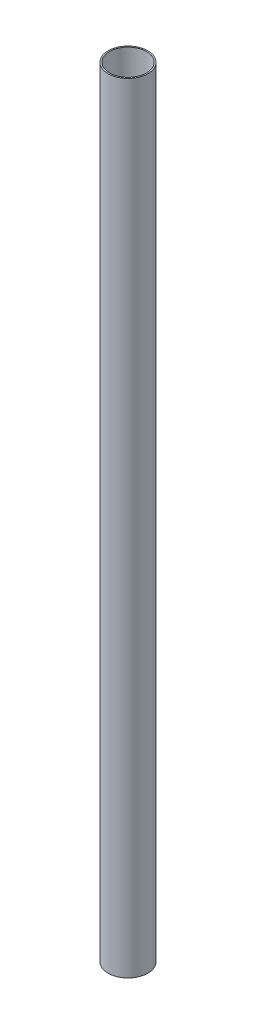
ISO-10303-21;
HEADER;
FILE_DESCRIPTION(('STEP AP214'),'2;1');
FILE_NAME('part.step','',(''),(''),'','','');
FILE_SCHEMA(('AUTOMOTIVE_DESIGN { 1 0 10303 214 1 1 1 1 }'));
ENDSEC;
DATA;
#1=APPLICATION_CONTEXT('core data for automotive mechanical design processes');
#2=APPLICATION_PROTOCOL_DEFINITION('international standard','automotive_design',2000,#1);
#3=PRODUCT_CONTEXT('',#1,'mechanical');
#4=PRODUCT('Part','Part','',(#3));
#5=PRODUCT_RELATED_PRODUCT_CATEGORY('part','',(#4));
#6=PRODUCT_DEFINITION_FORMATION('','',#4);
#7=PRODUCT_DEFINITION_CONTEXT('part definition',#1,'design');
#8=PRODUCT_DEFINITION('design','',#6,#7);
#9=PRODUCT_DEFINITION_SHAPE('','',#8);
#10=(LENGTH_UNIT() NAMED_UNIT(*) SI_UNIT(.MILLI.,.METRE.));
#11=(NAMED_UNIT(*) PLANE_ANGLE_UNIT() SI_UNIT($,.RADIAN.));
#12=(NAMED_UNIT(*) SI_UNIT($,.STERADIAN.) SOLID_ANGLE_UNIT());
#13=UNCERTAINTY_MEASURE_WITH_UNIT(LENGTH_MEASURE(1.E-05),#10,'distance_accuracy_value','');
#14=(GEOMETRIC_REPRESENTATION_CONTEXT(3) GLOBAL_UNCERTAINTY_ASSIGNED_CONTEXT((#13)) GLOBAL_UNIT_ASSIGNED_CONTEXT((#10,
#11,#12)) REPRESENTATION_CONTEXT('',''));
#15=CARTESIAN_POINT('',(0.,0.,0.));
#16=DIRECTION('',(0.,0.,1.));
#17=DIRECTION('',(1.,0.,0.));
#18=AXIS2_PLACEMENT_3D('',#15,#16,#17);
#19=CARTESIAN_POINT('',(0.,200.,0.));
#20=DIRECTION('',(0.,1.,0.));
#21=DIRECTION('',(0.,0.,1.));
#22=AXIS2_PLACEMENT_3D('',#19,#20,#21);
#23=PLANE('',#22);
#24=CARTESIAN_POINT('',(0.,200.,0.));
#25=DIRECTION('',(0.,1.,0.));
#26=DIRECTION('',(0.,0.,1.));
#27=AXIS2_PLACEMENT_3D('',#24,#25,#26);
#28=CIRCLE('',#27,5.10134343326391);
#29=CARTESIAN_POINT('',(0.,200.,5.10134343326391));
#30=VERTEX_POINT('',#29);
#31=EDGE_CURVE('E10',#30,#30,#28,.T.);
#32=ORIENTED_EDGE('',*,*,#31,.T.);
#33=EDGE_LOOP('',(#32));
#34=FACE_BOUND('',#33,.T.);
#35=CARTESIAN_POINT('',(0.,200.,0.));
#36=DIRECTION('',(0.,1.,0.));
#37=DIRECTION('',(0.,0.,1.));
#38=AXIS2_PLACEMENT_3D('',#35,#36,#37);
#39=CIRCLE('',#38,4.76040988243817);
#40=CARTESIAN_POINT('',(0.,200.,4.76040988243817));
#41=VERTEX_POINT('',#40);
#42=EDGE_CURVE('E42',#41,#41,#39,.T.);
#43=ORIENTED_EDGE('',*,*,#42,.F.);
#44=EDGE_LOOP('',(#43));
#45=FACE_BOUND('',#44,.T.);
#46=ADVANCED_FACE('F31',(#34,#45),#23,.T.);
#47=CARTESIAN_POINT('',(0.,0.,0.));
#48=DIRECTION('',(0.,1.,0.));
#49=DIRECTION('',(0.,0.,1.));
#50=AXIS2_PLACEMENT_3D('',#47,#48,#49);
#51=PLANE('',#50);
#52=CARTESIAN_POINT('',(0.,0.,0.));
#53=DIRECTION('',(0.,1.,0.));
#54=DIRECTION('',(0.,0.,1.));
#55=AXIS2_PLACEMENT_3D('',#52,#53,#54);
#56=CIRCLE('',#55,5.10134343326391);
#57=CARTESIAN_POINT('',(0.,0.,5.10134343326391));
#58=VERTEX_POINT('',#57);
#59=EDGE_CURVE('E35',#58,#58,#56,.T.);
#60=ORIENTED_EDGE('',*,*,#59,.F.);
#61=EDGE_LOOP('',(#60));
#62=FACE_BOUND('',#61,.T.);
#63=CARTESIAN_POINT('',(0.,0.,0.));
#64=DIRECTION('',(0.,1.,0.));
#65=DIRECTION('',(0.,0.,1.));
#66=AXIS2_PLACEMENT_3D('',#63,#64,#65);
#67=CIRCLE('',#66,4.76040988243817);
#68=CARTESIAN_POINT('',(0.,0.,4.76040988243817));
#69=VERTEX_POINT('',#68);
#70=EDGE_CURVE('E44',#69,#69,#67,.T.);
#71=ORIENTED_EDGE('',*,*,#70,.T.);
#72=EDGE_LOOP('',(#71));
#73=FACE_BOUND('',#72,.T.);
#74=ADVANCED_FACE('F54',(#62,#73),#51,.F.);
#75=CARTESIAN_POINT('',(0.,200.,0.));
#76=DIRECTION('',(0.,-1.,0.));
#77=DIRECTION('',(0.,0.,-1.));
#78=AXIS2_PLACEMENT_3D('',#75,#76,#77);
#79=CYLINDRICAL_SURFACE('',#78,5.10134343326391);
#80=ORIENTED_EDGE('',*,*,#31,.F.);
#81=EDGE_LOOP('',(#80));
#82=FACE_BOUND('',#81,.T.);
#83=ORIENTED_EDGE('',*,*,#59,.T.);
#84=EDGE_LOOP('',(#83));
#85=FACE_BOUND('',#84,.T.);
#86=ADVANCED_FACE('F33',(#82,#85),#79,.T.);
#87=CARTESIAN_POINT('',(0.,200.,0.));
#88=DIRECTION('',(0.,-1.,0.));
#89=DIRECTION('',(0.,0.,-1.));
#90=AXIS2_PLACEMENT_3D('',#87,#88,#89);
#91=CYLINDRICAL_SURFACE('',#90,4.76040988243817);
#92=ORIENTED_EDGE('',*,*,#42,.T.);
#93=EDGE_LOOP('',(#92));
#94=FACE_BOUND('',#93,.T.);
#95=ORIENTED_EDGE('',*,*,#70,.F.);
#96=EDGE_LOOP('',(#95));
#97=FACE_BOUND('',#96,.T.);
#98=ADVANCED_FACE('F50',(#94,#97),#91,.F.);
#99=CLOSED_SHELL('',(#46,#74,#86,#98));
#100=MANIFOLD_SOLID_BREP('B2',#99);
#101=ADVANCED_BREP_SHAPE_REPRESENTATION('',(#18,#100),#14);
#102=SHAPE_DEFINITION_REPRESENTATION(#9,#101);
ENDSEC;
END-ISO-10303-21;
